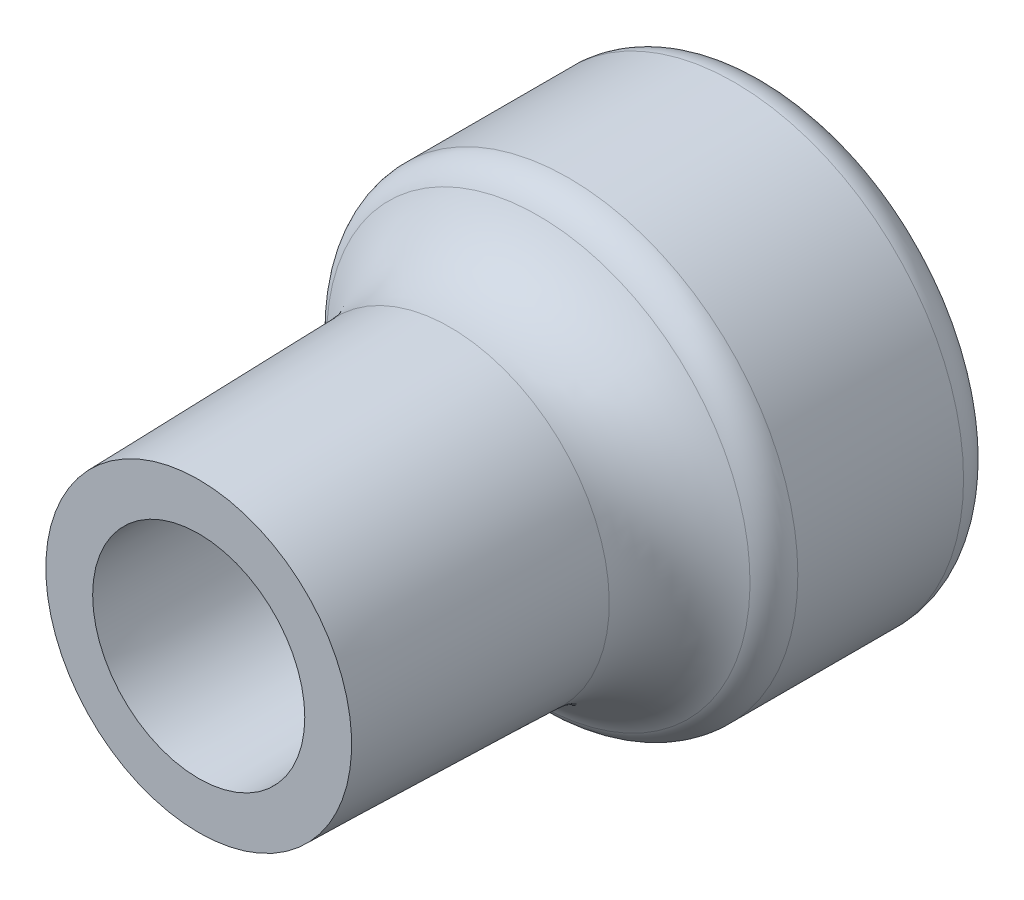
ISO-10303-21;
HEADER;
FILE_DESCRIPTION(('STEP AP214'),'2;1');
FILE_NAME('part.step','',(''),(''),'','','');
FILE_SCHEMA(('AUTOMOTIVE_DESIGN { 1 0 10303 214 1 1 1 1 }'));
ENDSEC;
DATA;
#1=APPLICATION_CONTEXT('core data for automotive mechanical design processes');
#2=APPLICATION_PROTOCOL_DEFINITION('international standard','automotive_design',2000,#1);
#3=PRODUCT_CONTEXT('',#1,'mechanical');
#4=PRODUCT('Part','Part','',(#3));
#5=PRODUCT_RELATED_PRODUCT_CATEGORY('part','',(#4));
#6=PRODUCT_DEFINITION_FORMATION('','',#4);
#7=PRODUCT_DEFINITION_CONTEXT('part definition',#1,'design');
#8=PRODUCT_DEFINITION('design','',#6,#7);
#9=PRODUCT_DEFINITION_SHAPE('','',#8);
#10=(LENGTH_UNIT() NAMED_UNIT(*) SI_UNIT(.MILLI.,.METRE.));
#11=(NAMED_UNIT(*) PLANE_ANGLE_UNIT() SI_UNIT($,.RADIAN.));
#12=(NAMED_UNIT(*) SI_UNIT($,.STERADIAN.) SOLID_ANGLE_UNIT());
#13=UNCERTAINTY_MEASURE_WITH_UNIT(LENGTH_MEASURE(1.E-05),#10,'distance_accuracy_value','');
#14=(GEOMETRIC_REPRESENTATION_CONTEXT(3) GLOBAL_UNCERTAINTY_ASSIGNED_CONTEXT((#13)) GLOBAL_UNIT_ASSIGNED_CONTEXT((#10,
#11,#12)) REPRESENTATION_CONTEXT('',''));
#15=CARTESIAN_POINT('',(0.,0.,0.));
#16=DIRECTION('',(0.,0.,1.));
#17=DIRECTION('',(1.,0.,0.));
#18=AXIS2_PLACEMENT_3D('',#15,#16,#17);
#19=CARTESIAN_POINT('',(0.,7.7,18.2441489361702));
#20=DIRECTION('',(0.,0.,-1.));
#21=DIRECTION('',(0.,1.,0.));
#22=AXIS2_PLACEMENT_3D('',#19,#20,#21);
#23=PLANE('',#22);
#24=CARTESIAN_POINT('',(0.,0.,18.2441489361702));
#25=DIRECTION('',(0.,0.,1.));
#26=DIRECTION('',(0.,-1.,0.));
#27=AXIS2_PLACEMENT_3D('',#24,#25,#26);
#28=CIRCLE('',#27,7.7);
#29=CARTESIAN_POINT('',(0.,-7.7,18.2441489361702));
#30=VERTEX_POINT('',#29);
#31=EDGE_CURVE('E67',#30,#30,#28,.T.);
#32=ORIENTED_EDGE('',*,*,#31,.F.);
#33=EDGE_LOOP('',(#32));
#34=FACE_BOUND('',#33,.T.);
#35=CARTESIAN_POINT('',(0.,0.,18.2441489361702));
#36=DIRECTION('',(0.,0.,1.));
#37=DIRECTION('',(0.,-1.,0.));
#38=AXIS2_PLACEMENT_3D('',#35,#36,#37);
#39=CIRCLE('',#38,11.1);
#40=CARTESIAN_POINT('',(0.,-11.1,18.2441489361702));
#41=VERTEX_POINT('',#40);
#42=EDGE_CURVE('E55',#41,#41,#39,.T.);
#43=ORIENTED_EDGE('',*,*,#42,.T.);
#44=EDGE_LOOP('',(#43));
#45=FACE_BOUND('',#44,.T.);
#46=ADVANCED_FACE('F32',(#34,#45),#23,.F.);
#47=CARTESIAN_POINT('',(0.,0.,0.));
#48=DIRECTION('',(0.,0.,-1.));
#49=DIRECTION('',(0.,1.,0.));
#50=AXIS2_PLACEMENT_3D('',#47,#48,#49);
#51=CONICAL_SURFACE('',#50,11.557,0.0250438896702512);
#52=ORIENTED_EDGE('',*,*,#42,.F.);
#53=EDGE_LOOP('',(#52));
#54=FACE_BOUND('',#53,.T.);
#55=CARTESIAN_POINT('',(0.,0.,0.));
#56=DIRECTION('',(0.,0.,1.));
#57=DIRECTION('',(0.,-1.,0.));
#58=AXIS2_PLACEMENT_3D('',#55,#56,#57);
#59=CIRCLE('',#58,11.557);
#60=CARTESIAN_POINT('',(0.,-11.557,0.));
#61=VERTEX_POINT('',#60);
#62=EDGE_CURVE('E58',#61,#61,#59,.T.);
#63=ORIENTED_EDGE('',*,*,#62,.T.);
#64=EDGE_LOOP('',(#63));
#65=FACE_BOUND('',#64,.T.);
#66=ADVANCED_FACE('F75',(#54,#65),#51,.T.);
#67=CARTESIAN_POINT('',(0.,0.,0.190814491467006));
#68=DIRECTION('',(0.,0.,1.));
#69=DIRECTION('',(0.,-1.,0.));
#70=AXIS2_PLACEMENT_3D('',#67,#68,#69);
#71=TOROIDAL_SURFACE('',#70,19.1746105065727,7.62);
#72=CARTESIAN_POINT('',(0.,0.,-6.40933344196926));
#73=DIRECTION('',(0.,0.,1.));
#74=DIRECTION('',(0.,-1.,0.));
#75=AXIS2_PLACEMENT_3D('',#72,#73,#74);
#76=CIRCLE('',#75,15.3664026266432);
#77=CARTESIAN_POINT('',(0.,-15.3664026266432,-6.40933344196926));
#78=VERTEX_POINT('',#77);
#79=EDGE_CURVE('E10',#78,#78,#76,.T.);
#80=ORIENTED_EDGE('',*,*,#79,.T.);
#81=EDGE_LOOP('',(#80));
#82=FACE_BOUND('',#81,.T.);
#83=ORIENTED_EDGE('',*,*,#62,.F.);
#84=EDGE_LOOP('',(#83));
#85=FACE_BOUND('',#84,.T.);
#86=ADVANCED_FACE('F81',(#82,#85),#71,.F.);
#87=CARTESIAN_POINT('',(0.,0.,18.2441489361702));
#88=DIRECTION('',(0.,0.,1.));
#89=DIRECTION('',(0.,-1.,0.));
#90=AXIS2_PLACEMENT_3D('',#87,#88,#89);
#91=CYLINDRICAL_SURFACE('',#90,16.637);
#92=CARTESIAN_POINT('',(0.,0.,-20.637729058192));
#93=DIRECTION('',(0.,0.,1.));
#94=DIRECTION('',(0.,-1.,0.));
#95=AXIS2_PLACEMENT_3D('',#92,#93,#94);
#96=CIRCLE('',#95,16.637);
#97=CARTESIAN_POINT('',(0.,-16.637,-20.637729058192));
#98=VERTEX_POINT('',#97);
#99=EDGE_CURVE('E43',#98,#98,#96,.T.);
#100=ORIENTED_EDGE('',*,*,#99,.T.);
#101=EDGE_LOOP('',(#100));
#102=FACE_BOUND('',#101,.T.);
#103=CARTESIAN_POINT('',(0.,0.,-8.60938275311468));
#104=DIRECTION('',(0.,0.,-1.));
#105=DIRECTION('',(0.,1.,0.));
#106=AXIS2_PLACEMENT_3D('',#103,#104,#105);
#107=CIRCLE('',#106,16.637);
#108=CARTESIAN_POINT('',(0.,16.637,-8.60938275311467));
#109=VERTEX_POINT('',#108);
#110=EDGE_CURVE('E47',#109,#109,#107,.T.);
#111=ORIENTED_EDGE('',*,*,#110,.T.);
#112=EDGE_LOOP('',(#111));
#113=FACE_BOUND('',#112,.T.);
#114=ADVANCED_FACE('F86',(#102,#113),#91,.T.);
#115=CARTESIAN_POINT('',(0.,16.637,-23.177729058192));
#116=DIRECTION('',(0.,0.,1.));
#117=DIRECTION('',(0.,-1.,0.));
#118=AXIS2_PLACEMENT_3D('',#115,#116,#117);
#119=PLANE('',#118);
#120=CARTESIAN_POINT('',(0.,0.,-23.177729058192));
#121=DIRECTION('',(0.,0.,1.));
#122=DIRECTION('',(0.,-1.,0.));
#123=AXIS2_PLACEMENT_3D('',#120,#121,#122);
#124=CIRCLE('',#123,14.097);
#125=CARTESIAN_POINT('',(0.,-14.097,-23.177729058192));
#126=VERTEX_POINT('',#125);
#127=EDGE_CURVE('E39',#126,#126,#124,.F.);
#128=ORIENTED_EDGE('',*,*,#127,.T.);
#129=EDGE_LOOP('',(#128));
#130=FACE_BOUND('',#129,.T.);
#131=CARTESIAN_POINT('',(0.,0.,-23.177729058192));
#132=DIRECTION('',(0.,0.,1.));
#133=DIRECTION('',(0.,-1.,0.));
#134=AXIS2_PLACEMENT_3D('',#131,#132,#133);
#135=CIRCLE('',#134,11.557);
#136=CARTESIAN_POINT('',(0.,-11.557,-23.177729058192));
#137=VERTEX_POINT('',#136);
#138=EDGE_CURVE('E61',#137,#137,#135,.T.);
#139=ORIENTED_EDGE('',*,*,#138,.T.);
#140=EDGE_LOOP('',(#139));
#141=FACE_BOUND('',#140,.T.);
#142=ADVANCED_FACE('F91',(#130,#141),#119,.F.);
#143=CARTESIAN_POINT('',(0.,0.,18.2441489361702));
#144=DIRECTION('',(0.,0.,1.));
#145=DIRECTION('',(0.,-1.,0.));
#146=AXIS2_PLACEMENT_3D('',#143,#144,#145);
#147=CYLINDRICAL_SURFACE('',#146,11.557);
#148=ORIENTED_EDGE('',*,*,#138,.F.);
#149=EDGE_LOOP('',(#148));
#150=FACE_BOUND('',#149,.T.);
#151=CARTESIAN_POINT('',(0.,0.,-7.937729058192));
#152=DIRECTION('',(0.,0.,1.));
#153=DIRECTION('',(0.,-1.,0.));
#154=AXIS2_PLACEMENT_3D('',#151,#152,#153);
#155=CIRCLE('',#154,11.557);
#156=CARTESIAN_POINT('',(0.,-11.557,-7.937729058192));
#157=VERTEX_POINT('',#156);
#158=EDGE_CURVE('E64',#157,#157,#155,.T.);
#159=ORIENTED_EDGE('',*,*,#158,.T.);
#160=EDGE_LOOP('',(#159));
#161=FACE_BOUND('',#160,.T.);
#162=ADVANCED_FACE('F127',(#150,#161),#147,.F.);
#163=CARTESIAN_POINT('',(0.,0.,18.2441489361702));
#164=DIRECTION('',(0.,0.,1.));
#165=DIRECTION('',(0.,-1.,0.));
#166=AXIS2_PLACEMENT_3D('',#163,#164,#165);
#167=CONICAL_SURFACE('',#166,7.7,0.00763872286098582);
#168=CARTESIAN_POINT('',(0.,0.,-2.93098031267747));
#169=DIRECTION('',(0.,0.,-1.));
#170=DIRECTION('',(0.,1.,0.));
#171=AXIS2_PLACEMENT_3D('',#168,#169,#170);
#172=CIRCLE('',#171,7.53824590998852);
#173=CARTESIAN_POINT('',(0.,7.53824590998852,-2.93098031267747));
#174=VERTEX_POINT('',#173);
#175=EDGE_CURVE('E52',#174,#174,#172,.T.);
#176=ORIENTED_EDGE('',*,*,#175,.T.);
#177=EDGE_LOOP('',(#176));
#178=FACE_BOUND('',#177,.T.);
#179=ORIENTED_EDGE('',*,*,#31,.T.);
#180=EDGE_LOOP('',(#179));
#181=FACE_BOUND('',#180,.T.);
#182=ADVANCED_FACE('F71',(#178,#181),#167,.F.);
#183=CARTESIAN_POINT('',(0.,0.,-2.96978464743589));
#184=DIRECTION('',(0.,0.,-1.));
#185=DIRECTION('',(0.,1.,0.));
#186=AXIS2_PLACEMENT_3D('',#183,#184,#185);
#187=TOROIDAL_SURFACE('',#186,12.6180977014883,5.08);
#188=ORIENTED_EDGE('',*,*,#175,.F.);
#189=EDGE_LOOP('',(#188));
#190=FACE_BOUND('',#189,.T.);
#191=ORIENTED_EDGE('',*,*,#158,.F.);
#192=EDGE_LOOP('',(#191));
#193=FACE_BOUND('',#192,.T.);
#194=ADVANCED_FACE('F96',(#190,#193),#187,.T.);
#195=CARTESIAN_POINT('',(0.,0.,-20.637729058192));
#196=DIRECTION('',(0.,0.,1.));
#197=DIRECTION('',(0.,-1.,0.));
#198=AXIS2_PLACEMENT_3D('',#195,#196,#197);
#199=TOROIDAL_SURFACE('',#198,14.097,2.54);
#200=ORIENTED_EDGE('',*,*,#127,.F.);
#201=EDGE_LOOP('',(#200));
#202=FACE_BOUND('',#201,.T.);
#203=ORIENTED_EDGE('',*,*,#99,.F.);
#204=EDGE_LOOP('',(#203));
#205=FACE_BOUND('',#204,.T.);
#206=ADVANCED_FACE('F98',(#202,#205),#199,.T.);
#207=CARTESIAN_POINT('',(0.,0.,-8.60938275311467));
#208=DIRECTION('',(0.,0.,-1.));
#209=DIRECTION('',(0.,1.,0.));
#210=AXIS2_PLACEMENT_3D('',#207,#208,#209);
#211=TOROIDAL_SURFACE('',#210,14.097,2.54);
#212=ORIENTED_EDGE('',*,*,#110,.F.);
#213=EDGE_LOOP('',(#212));
#214=FACE_BOUND('',#213,.T.);
#215=ORIENTED_EDGE('',*,*,#79,.F.);
#216=EDGE_LOOP('',(#215));
#217=FACE_BOUND('',#216,.T.);
#218=ADVANCED_FACE('F34',(#214,#217),#211,.T.);
#219=CLOSED_SHELL('',(#46,#66,#86,#114,#142,#162,#182,#194,#206,#218));
#220=MANIFOLD_SOLID_BREP('B2',#219);
#221=ADVANCED_BREP_SHAPE_REPRESENTATION('',(#18,#220),#14);
#222=SHAPE_DEFINITION_REPRESENTATION(#9,#221);
ENDSEC;
END-ISO-10303-21;
